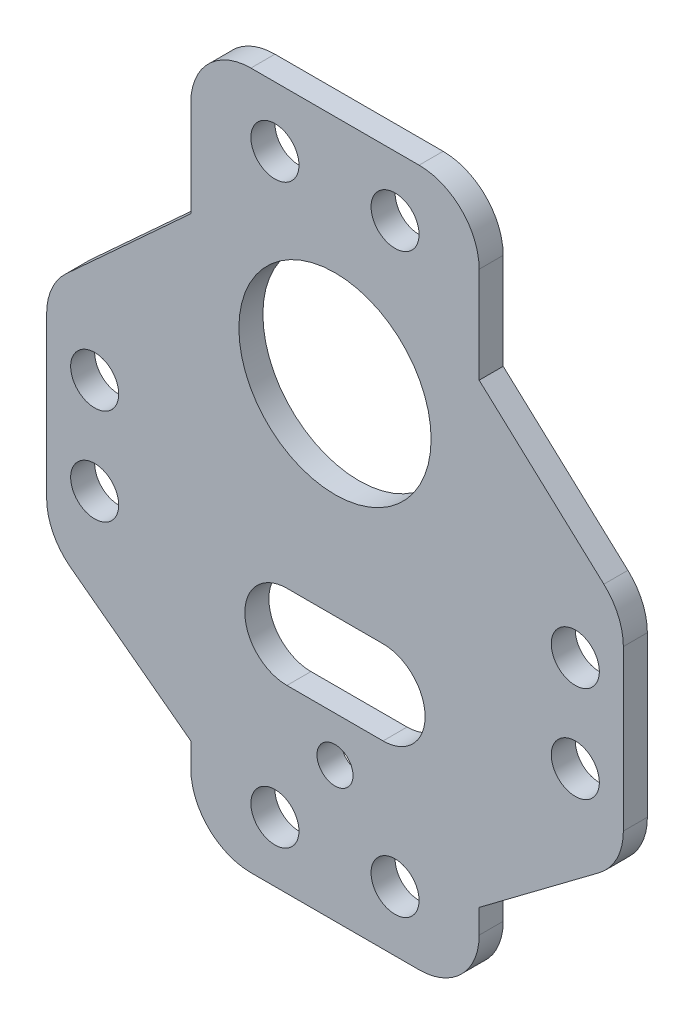
ISO-10303-21;
HEADER;
FILE_DESCRIPTION(('STEP AP214'),'2;1');
FILE_NAME('part.step','',(''),(''),'','','');
FILE_SCHEMA(('AUTOMOTIVE_DESIGN { 1 0 10303 214 1 1 1 1 }'));
ENDSEC;
DATA;
#1=APPLICATION_CONTEXT('core data for automotive mechanical design processes');
#2=APPLICATION_PROTOCOL_DEFINITION('international standard','automotive_design',2000,#1);
#3=PRODUCT_CONTEXT('',#1,'mechanical');
#4=PRODUCT('Part','Part','',(#3));
#5=PRODUCT_RELATED_PRODUCT_CATEGORY('part','',(#4));
#6=PRODUCT_DEFINITION_FORMATION('','',#4);
#7=PRODUCT_DEFINITION_CONTEXT('part definition',#1,'design');
#8=PRODUCT_DEFINITION('design','',#6,#7);
#9=PRODUCT_DEFINITION_SHAPE('','',#8);
#10=(LENGTH_UNIT() NAMED_UNIT(*) SI_UNIT(.MILLI.,.METRE.));
#11=(NAMED_UNIT(*) PLANE_ANGLE_UNIT() SI_UNIT($,.RADIAN.));
#12=(NAMED_UNIT(*) SI_UNIT($,.STERADIAN.) SOLID_ANGLE_UNIT());
#13=UNCERTAINTY_MEASURE_WITH_UNIT(LENGTH_MEASURE(1.E-05),#10,'distance_accuracy_value','');
#14=(GEOMETRIC_REPRESENTATION_CONTEXT(3) GLOBAL_UNCERTAINTY_ASSIGNED_CONTEXT((#13)) GLOBAL_UNIT_ASSIGNED_CONTEXT((#10,
#11,#12)) REPRESENTATION_CONTEXT('',''));
#15=CARTESIAN_POINT('',(0.,0.,0.));
#16=DIRECTION('',(0.,0.,1.));
#17=DIRECTION('',(1.,0.,0.));
#18=AXIS2_PLACEMENT_3D('',#15,#16,#17);
#19=CARTESIAN_POINT('',(0.,0.,2.));
#20=DIRECTION('',(0.,0.,-1.));
#21=DIRECTION('',(-1.,0.,0.));
#22=AXIS2_PLACEMENT_3D('',#19,#20,#21);
#23=PLANE('',#22);
#24=CARTESIAN_POINT('',(3.,-24.,2.));
#25=DIRECTION('',(0.,0.,1.));
#26=DIRECTION('',(1.,0.,0.));
#27=AXIS2_PLACEMENT_3D('',#24,#25,#26);
#28=CIRCLE('',#27,2.);
#29=CARTESIAN_POINT('',(5.,-24.,2.));
#30=VERTEX_POINT('',#29);
#31=EDGE_CURVE('E1252',#30,#30,#28,.T.);
#32=ORIENTED_EDGE('',*,*,#31,.F.);
#33=EDGE_LOOP('',(#32));
#34=FACE_BOUND('',#33,.T.);
#35=CARTESIAN_POINT('',(-12.,-48.,2.));
#36=DIRECTION('',(0.,0.,1.));
#37=DIRECTION('',(1.,0.,0.));
#38=AXIS2_PLACEMENT_3D('',#35,#36,#37);
#39=CIRCLE('',#38,2.);
#40=CARTESIAN_POINT('',(-9.99999999999999,-48.,2.));
#41=VERTEX_POINT('',#40);
#42=EDGE_CURVE('E1262',#41,#41,#39,.T.);
#43=ORIENTED_EDGE('',*,*,#42,.F.);
#44=EDGE_LOOP('',(#43));
#45=FACE_BOUND('',#44,.T.);
#46=CARTESIAN_POINT('',(3.,-72.,2.));
#47=DIRECTION('',(0.,0.,1.));
#48=DIRECTION('',(1.,0.,0.));
#49=AXIS2_PLACEMENT_3D('',#46,#47,#48);
#50=CIRCLE('',#49,2.);
#51=CARTESIAN_POINT('',(5.,-72.,2.));
#52=VERTEX_POINT('',#51);
#53=EDGE_CURVE('E1272',#52,#52,#50,.T.);
#54=ORIENTED_EDGE('',*,*,#53,.F.);
#55=EDGE_LOOP('',(#54));
#56=FACE_BOUND('',#55,.T.);
#57=CARTESIAN_POINT('',(28.,-56.,2.));
#58=DIRECTION('',(0.,0.,-1.));
#59=DIRECTION('',(-1.,0.,0.));
#60=AXIS2_PLACEMENT_3D('',#57,#58,#59);
#61=CIRCLE('',#60,2.);
#62=CARTESIAN_POINT('',(26.,-56.,2.));
#63=VERTEX_POINT('',#62);
#64=EDGE_CURVE('E1278',#63,#63,#61,.T.);
#65=ORIENTED_EDGE('',*,*,#64,.T.);
#66=EDGE_LOOP('',(#65));
#67=FACE_BOUND('',#66,.T.);
#68=CARTESIAN_POINT('',(28.,-48.,2.));
#69=DIRECTION('',(0.,0.,-1.));
#70=DIRECTION('',(-1.,0.,0.));
#71=AXIS2_PLACEMENT_3D('',#68,#69,#70);
#72=CIRCLE('',#71,2.);
#73=CARTESIAN_POINT('',(26.,-48.,2.));
#74=VERTEX_POINT('',#73);
#75=EDGE_CURVE('E1284',#74,#74,#72,.T.);
#76=ORIENTED_EDGE('',*,*,#75,.T.);
#77=EDGE_LOOP('',(#76));
#78=FACE_BOUND('',#77,.T.);
#79=DIRECTION('',(1.,0.,0.));
#80=VECTOR('',#79,1.);
#81=CARTESIAN_POINT('',(4.,-62.,2.));
#82=LINE('',#81,#80);
#83=CARTESIAN_POINT('',(4.,-62.,2.));
#84=VERTEX_POINT('',#83);
#85=CARTESIAN_POINT('',(12.,-62.,2.));
#86=VERTEX_POINT('',#85);
#87=EDGE_CURVE('E636',#84,#86,#82,.T.);
#88=ORIENTED_EDGE('',*,*,#87,.F.);
#89=CARTESIAN_POINT('',(4.,-58.5,2.));
#90=DIRECTION('',(0.,0.,1.));
#91=DIRECTION('',(1.,0.,0.));
#92=AXIS2_PLACEMENT_3D('',#89,#90,#91);
#93=CIRCLE('',#92,3.5);
#94=CARTESIAN_POINT('',(4.,-55.,2.));
#95=VERTEX_POINT('',#94);
#96=EDGE_CURVE('E660',#95,#84,#93,.T.);
#97=ORIENTED_EDGE('',*,*,#96,.F.);
#98=DIRECTION('',(1.,0.,0.));
#99=VECTOR('',#98,1.);
#100=CARTESIAN_POINT('',(4.,-55.,2.));
#101=LINE('',#100,#99);
#102=CARTESIAN_POINT('',(12.,-55.,2.));
#103=VERTEX_POINT('',#102);
#104=EDGE_CURVE('E658',#95,#103,#101,.T.);
#105=ORIENTED_EDGE('',*,*,#104,.T.);
#106=CARTESIAN_POINT('',(12.,-58.5,2.));
#107=DIRECTION('',(0.,0.,1.));
#108=DIRECTION('',(1.,0.,0.));
#109=AXIS2_PLACEMENT_3D('',#106,#107,#108);
#110=CIRCLE('',#109,3.5);
#111=EDGE_CURVE('E646',#86,#103,#110,.T.);
#112=ORIENTED_EDGE('',*,*,#111,.F.);
#113=EDGE_LOOP('',(#88,#97,#105,#112));
#114=FACE_BOUND('',#113,.T.);
#115=DIRECTION('',(-0.800000000000001,-0.599999999999999,0.));
#116=VECTOR('',#115,1.);
#117=CARTESIAN_POINT('',(32.,-61.,2.));
#118=LINE('',#117,#116);
#119=CARTESIAN_POINT('',(30.,-62.5,2.));
#120=VERTEX_POINT('',#119);
#121=CARTESIAN_POINT('',(20.,-70.,2.));
#122=VERTEX_POINT('',#121);
#123=EDGE_CURVE('E687',#120,#122,#118,.T.);
#124=ORIENTED_EDGE('',*,*,#123,.F.);
#125=CARTESIAN_POINT('',(27.,-58.5,2.));
#126=DIRECTION('',(0.,0.,-1.));
#127=DIRECTION('',(-1.,0.,0.));
#128=AXIS2_PLACEMENT_3D('',#125,#126,#127);
#129=CIRCLE('',#128,5.);
#130=CARTESIAN_POINT('',(32.,-58.5,2.));
#131=VERTEX_POINT('',#130);
#132=EDGE_CURVE('E791',#120,#131,#129,.F.);
#133=ORIENTED_EDGE('',*,*,#132,.T.);
#134=DIRECTION('',(0.,-1.,0.));
#135=VECTOR('',#134,1.);
#136=CARTESIAN_POINT('',(32.,-43.,2.));
#137=LINE('',#136,#135);
#138=CARTESIAN_POINT('',(32.,-45.1995085817082,2.));
#139=VERTEX_POINT('',#138);
#140=EDGE_CURVE('E684',#139,#131,#137,.T.);
#141=ORIENTED_EDGE('',*,*,#140,.F.);
#142=CARTESIAN_POINT('',(27.,-45.1995085817082,2.));
#143=DIRECTION('',(0.,0.,-1.));
#144=DIRECTION('',(-1.,0.,0.));
#145=AXIS2_PLACEMENT_3D('',#142,#143,#144);
#146=CIRCLE('',#145,5.);
#147=CARTESIAN_POINT('',(30.3786231425867,-41.5137378807045,2.));
#148=VERTEX_POINT('',#147);
#149=EDGE_CURVE('E789',#139,#148,#146,.F.);
#150=ORIENTED_EDGE('',*,*,#149,.T.);
#151=DIRECTION('',(-0.737154140200742,0.675724628517346,0.));
#152=VECTOR('',#151,1.);
#153=CARTESIAN_POINT('',(32.,-43.,2.));
#154=LINE('',#153,#152);
#155=CARTESIAN_POINT('',(20.,-32.,2.));
#156=VERTEX_POINT('',#155);
#157=EDGE_CURVE('E712',#148,#156,#154,.T.);
#158=ORIENTED_EDGE('',*,*,#157,.T.);
#159=DIRECTION('',(0.,1.,0.));
#160=VECTOR('',#159,1.);
#161=CARTESIAN_POINT('',(20.,-32.,2.));
#162=LINE('',#161,#160);
#163=CARTESIAN_POINT('',(20.,-24.,2.));
#164=VERTEX_POINT('',#163);
#165=EDGE_CURVE('E709',#156,#164,#162,.T.);
#166=ORIENTED_EDGE('',*,*,#165,.T.);
#167=CARTESIAN_POINT('',(15.,-24.,2.));
#168=DIRECTION('',(0.,0.,-1.));
#169=DIRECTION('',(-1.,0.,0.));
#170=AXIS2_PLACEMENT_3D('',#167,#168,#169);
#171=CIRCLE('',#170,5.);
#172=CARTESIAN_POINT('',(15.,-19.,2.));
#173=VERTEX_POINT('',#172);
#174=EDGE_CURVE('E781',#164,#173,#171,.F.);
#175=ORIENTED_EDGE('',*,*,#174,.T.);
#176=DIRECTION('',(-1.,0.,0.));
#177=VECTOR('',#176,1.);
#178=CARTESIAN_POINT('',(20.,-19.,2.));
#179=LINE('',#178,#177);
#180=CARTESIAN_POINT('',(0.999999999999997,-19.,2.));
#181=VERTEX_POINT('',#180);
#182=EDGE_CURVE('E706',#173,#181,#179,.T.);
#183=ORIENTED_EDGE('',*,*,#182,.T.);
#184=CARTESIAN_POINT('',(0.999999999999999,-24.,2.));
#185=DIRECTION('',(0.,0.,-1.));
#186=DIRECTION('',(-1.,0.,0.));
#187=AXIS2_PLACEMENT_3D('',#184,#185,#186);
#188=CIRCLE('',#187,5.);
#189=CARTESIAN_POINT('',(-4.,-24.,2.));
#190=VERTEX_POINT('',#189);
#191=EDGE_CURVE('E783',#181,#190,#188,.F.);
#192=ORIENTED_EDGE('',*,*,#191,.T.);
#193=DIRECTION('',(0.,1.,0.));
#194=VECTOR('',#193,1.);
#195=CARTESIAN_POINT('',(-4.00000000000001,-32.,2.));
#196=LINE('',#195,#194);
#197=CARTESIAN_POINT('',(-4.00000000000001,-32.,2.));
#198=VERTEX_POINT('',#197);
#199=EDGE_CURVE('E703',#198,#190,#196,.T.);
#200=ORIENTED_EDGE('',*,*,#199,.F.);
#201=DIRECTION('',(0.737154140200741,0.675724628517347,0.));
#202=VECTOR('',#201,1.);
#203=CARTESIAN_POINT('',(-16.,-43.,2.));
#204=LINE('',#203,#202);
#205=CARTESIAN_POINT('',(-14.3786231425867,-41.5137378807045,2.));
#206=VERTEX_POINT('',#205);
#207=EDGE_CURVE('E701',#206,#198,#204,.T.);
#208=ORIENTED_EDGE('',*,*,#207,.F.);
#209=CARTESIAN_POINT('',(-11.,-45.1995085817082,2.));
#210=DIRECTION('',(0.,0.,-1.));
#211=DIRECTION('',(-1.,0.,0.));
#212=AXIS2_PLACEMENT_3D('',#209,#210,#211);
#213=CIRCLE('',#212,5.);
#214=CARTESIAN_POINT('',(-16.,-45.1995085817082,2.));
#215=VERTEX_POINT('',#214);
#216=EDGE_CURVE('E785',#206,#215,#213,.F.);
#217=ORIENTED_EDGE('',*,*,#216,.T.);
#218=DIRECTION('',(0.,-1.,0.));
#219=VECTOR('',#218,1.);
#220=CARTESIAN_POINT('',(-16.,-43.,2.));
#221=LINE('',#220,#219);
#222=CARTESIAN_POINT('',(-16.,-58.5,2.));
#223=VERTEX_POINT('',#222);
#224=EDGE_CURVE('E698',#215,#223,#221,.T.);
#225=ORIENTED_EDGE('',*,*,#224,.T.);
#226=CARTESIAN_POINT('',(-11.,-58.5,2.));
#227=DIRECTION('',(0.,0.,-1.));
#228=DIRECTION('',(-1.,0.,0.));
#229=AXIS2_PLACEMENT_3D('',#226,#227,#228);
#230=CIRCLE('',#229,5.);
#231=CARTESIAN_POINT('',(-14.,-62.5,2.));
#232=VERTEX_POINT('',#231);
#233=EDGE_CURVE('E787',#223,#232,#230,.F.);
#234=ORIENTED_EDGE('',*,*,#233,.T.);
#235=DIRECTION('',(0.8,-0.6,0.));
#236=VECTOR('',#235,1.);
#237=CARTESIAN_POINT('',(-16.,-61.,2.));
#238=LINE('',#237,#236);
#239=CARTESIAN_POINT('',(-4.,-70.,2.));
#240=VERTEX_POINT('',#239);
#241=EDGE_CURVE('E696',#232,#240,#238,.T.);
#242=ORIENTED_EDGE('',*,*,#241,.T.);
#243=DIRECTION('',(0.,-1.,0.));
#244=VECTOR('',#243,1.);
#245=CARTESIAN_POINT('',(-4.,-70.,2.));
#246=LINE('',#245,#244);
#247=CARTESIAN_POINT('',(-4.,-72.,2.));
#248=VERTEX_POINT('',#247);
#249=EDGE_CURVE('E694',#240,#248,#246,.T.);
#250=ORIENTED_EDGE('',*,*,#249,.T.);
#251=CARTESIAN_POINT('',(1.,-72.,2.));
#252=DIRECTION('',(0.,0.,-1.));
#253=DIRECTION('',(-1.,0.,0.));
#254=AXIS2_PLACEMENT_3D('',#251,#252,#253);
#255=CIRCLE('',#254,5.);
#256=CARTESIAN_POINT('',(1.,-77.,2.));
#257=VERTEX_POINT('',#256);
#258=EDGE_CURVE('E494',#248,#257,#255,.F.);
#259=ORIENTED_EDGE('',*,*,#258,.T.);
#260=DIRECTION('',(-1.,0.,0.));
#261=VECTOR('',#260,1.);
#262=CARTESIAN_POINT('',(20.,-77.,2.));
#263=LINE('',#262,#261);
#264=CARTESIAN_POINT('',(15.,-77.,2.));
#265=VERTEX_POINT('',#264);
#266=EDGE_CURVE('E692',#265,#257,#263,.T.);
#267=ORIENTED_EDGE('',*,*,#266,.F.);
#268=CARTESIAN_POINT('',(15.,-72.,2.));
#269=DIRECTION('',(0.,0.,-1.));
#270=DIRECTION('',(-1.,0.,0.));
#271=AXIS2_PLACEMENT_3D('',#268,#269,#270);
#272=CIRCLE('',#271,5.);
#273=CARTESIAN_POINT('',(20.,-72.,2.));
#274=VERTEX_POINT('',#273);
#275=EDGE_CURVE('E488',#265,#274,#272,.F.);
#276=ORIENTED_EDGE('',*,*,#275,.T.);
#277=DIRECTION('',(0.,-1.,0.));
#278=VECTOR('',#277,1.);
#279=CARTESIAN_POINT('',(20.,-70.,2.));
#280=LINE('',#279,#278);
#281=EDGE_CURVE('E690',#122,#274,#280,.T.);
#282=ORIENTED_EDGE('',*,*,#281,.F.);
#283=EDGE_LOOP('',(#124,#133,#141,#150,#158,#166,#175,#183,#192,#200,#208,#217,#225,#234,#242,
#250,#259,#267,#276,#282));
#284=FACE_BOUND('',#283,.T.);
#285=CARTESIAN_POINT('',(8.00000000000001,-38.25,2.));
#286=DIRECTION('',(0.,0.,1.));
#287=DIRECTION('',(1.,0.,0.));
#288=AXIS2_PLACEMENT_3D('',#285,#286,#287);
#289=CIRCLE('',#288,8.);
#290=CARTESIAN_POINT('',(16.,-38.25,2.));
#291=VERTEX_POINT('',#290);
#292=EDGE_CURVE('E678',#291,#291,#289,.T.);
#293=ORIENTED_EDGE('',*,*,#292,.F.);
#294=EDGE_LOOP('',(#293));
#295=FACE_BOUND('',#294,.T.);
#296=CARTESIAN_POINT('',(13.,-72.,2.));
#297=DIRECTION('',(0.,0.,1.));
#298=DIRECTION('',(1.,0.,0.));
#299=AXIS2_PLACEMENT_3D('',#296,#297,#298);
#300=CIRCLE('',#299,2.);
#301=CARTESIAN_POINT('',(15.,-72.,2.));
#302=VERTEX_POINT('',#301);
#303=EDGE_CURVE('E667',#302,#302,#300,.T.);
#304=ORIENTED_EDGE('',*,*,#303,.F.);
#305=EDGE_LOOP('',(#304));
#306=FACE_BOUND('',#305,.T.);
#307=CARTESIAN_POINT('',(-12.,-56.,2.));
#308=DIRECTION('',(0.,0.,1.));
#309=DIRECTION('',(1.,0.,0.));
#310=AXIS2_PLACEMENT_3D('',#307,#308,#309);
#311=CIRCLE('',#310,2.);
#312=CARTESIAN_POINT('',(-9.99999999999999,-56.,2.));
#313=VERTEX_POINT('',#312);
#314=EDGE_CURVE('E1267',#313,#313,#311,.T.);
#315=ORIENTED_EDGE('',*,*,#314,.F.);
#316=EDGE_LOOP('',(#315));
#317=FACE_BOUND('',#316,.T.);
#318=CARTESIAN_POINT('',(13.,-24.,2.));
#319=DIRECTION('',(0.,0.,1.));
#320=DIRECTION('',(1.,0.,0.));
#321=AXIS2_PLACEMENT_3D('',#318,#319,#320);
#322=CIRCLE('',#321,2.);
#323=CARTESIAN_POINT('',(15.,-24.,2.));
#324=VERTEX_POINT('',#323);
#325=EDGE_CURVE('E1257',#324,#324,#322,.T.);
#326=ORIENTED_EDGE('',*,*,#325,.F.);
#327=EDGE_LOOP('',(#326));
#328=FACE_BOUND('',#327,.T.);
#329=CARTESIAN_POINT('',(8.00000000000001,-65.75,2.));
#330=DIRECTION('',(0.,0.,1.));
#331=DIRECTION('',(1.,0.,0.));
#332=AXIS2_PLACEMENT_3D('',#329,#330,#331);
#333=CIRCLE('',#332,1.5);
#334=CARTESIAN_POINT('',(9.50000000000002,-65.75,2.));
#335=VERTEX_POINT('',#334);
#336=EDGE_CURVE('E1246',#335,#335,#333,.T.);
#337=ORIENTED_EDGE('',*,*,#336,.F.);
#338=EDGE_LOOP('',(#337));
#339=FACE_BOUND('',#338,.T.);
#340=ADVANCED_FACE('F473',(#34,#45,#56,#67,#78,#114,#284,#295,#306,#317,#328,#339),#23,.F.);
#341=CARTESIAN_POINT('',(0.,0.,0.));
#342=DIRECTION('',(0.,0.,-1.));
#343=DIRECTION('',(-1.,0.,0.));
#344=AXIS2_PLACEMENT_3D('',#341,#342,#343);
#345=PLANE('',#344);
#346=CARTESIAN_POINT('',(3.,-24.,0.));
#347=DIRECTION('',(0.,0.,1.));
#348=DIRECTION('',(1.,0.,0.));
#349=AXIS2_PLACEMENT_3D('',#346,#347,#348);
#350=CIRCLE('',#349,2.);
#351=CARTESIAN_POINT('',(5.,-24.,0.));
#352=VERTEX_POINT('',#351);
#353=EDGE_CURVE('E1249',#352,#352,#350,.T.);
#354=ORIENTED_EDGE('',*,*,#353,.T.);
#355=EDGE_LOOP('',(#354));
#356=FACE_BOUND('',#355,.T.);
#357=CARTESIAN_POINT('',(-12.,-48.,0.));
#358=DIRECTION('',(0.,0.,1.));
#359=DIRECTION('',(1.,0.,0.));
#360=AXIS2_PLACEMENT_3D('',#357,#358,#359);
#361=CIRCLE('',#360,2.);
#362=CARTESIAN_POINT('',(-9.99999999999999,-48.,0.));
#363=VERTEX_POINT('',#362);
#364=EDGE_CURVE('E1260',#363,#363,#361,.T.);
#365=ORIENTED_EDGE('',*,*,#364,.T.);
#366=EDGE_LOOP('',(#365));
#367=FACE_BOUND('',#366,.T.);
#368=CARTESIAN_POINT('',(3.,-72.,0.));
#369=DIRECTION('',(0.,0.,1.));
#370=DIRECTION('',(1.,0.,0.));
#371=AXIS2_PLACEMENT_3D('',#368,#369,#370);
#372=CIRCLE('',#371,2.);
#373=CARTESIAN_POINT('',(5.,-72.,0.));
#374=VERTEX_POINT('',#373);
#375=EDGE_CURVE('E1270',#374,#374,#372,.T.);
#376=ORIENTED_EDGE('',*,*,#375,.T.);
#377=EDGE_LOOP('',(#376));
#378=FACE_BOUND('',#377,.T.);
#379=CARTESIAN_POINT('',(28.,-56.,0.));
#380=DIRECTION('',(0.,0.,-1.));
#381=DIRECTION('',(-1.,0.,0.));
#382=AXIS2_PLACEMENT_3D('',#379,#380,#381);
#383=CIRCLE('',#382,2.);
#384=CARTESIAN_POINT('',(26.,-56.,0.));
#385=VERTEX_POINT('',#384);
#386=EDGE_CURVE('E1275',#385,#385,#383,.T.);
#387=ORIENTED_EDGE('',*,*,#386,.F.);
#388=EDGE_LOOP('',(#387));
#389=FACE_BOUND('',#388,.T.);
#390=CARTESIAN_POINT('',(28.,-48.,0.));
#391=DIRECTION('',(0.,0.,-1.));
#392=DIRECTION('',(-1.,0.,0.));
#393=AXIS2_PLACEMENT_3D('',#390,#391,#392);
#394=CIRCLE('',#393,2.);
#395=CARTESIAN_POINT('',(26.,-48.,0.));
#396=VERTEX_POINT('',#395);
#397=EDGE_CURVE('E1281',#396,#396,#394,.T.);
#398=ORIENTED_EDGE('',*,*,#397,.F.);
#399=EDGE_LOOP('',(#398));
#400=FACE_BOUND('',#399,.T.);
#401=CARTESIAN_POINT('',(4.,-58.5,0.));
#402=DIRECTION('',(0.,0.,1.));
#403=DIRECTION('',(1.,0.,0.));
#404=AXIS2_PLACEMENT_3D('',#401,#402,#403);
#405=CIRCLE('',#404,3.5);
#406=CARTESIAN_POINT('',(4.,-55.,0.));
#407=VERTEX_POINT('',#406);
#408=CARTESIAN_POINT('',(4.,-62.,0.));
#409=VERTEX_POINT('',#408);
#410=EDGE_CURVE('E647',#407,#409,#405,.T.);
#411=ORIENTED_EDGE('',*,*,#410,.T.);
#412=DIRECTION('',(1.,0.,0.));
#413=VECTOR('',#412,1.);
#414=CARTESIAN_POINT('',(4.,-62.,0.));
#415=LINE('',#414,#413);
#416=CARTESIAN_POINT('',(12.,-62.,0.));
#417=VERTEX_POINT('',#416);
#418=EDGE_CURVE('E665',#409,#417,#415,.T.);
#419=ORIENTED_EDGE('',*,*,#418,.T.);
#420=CARTESIAN_POINT('',(12.,-58.5,0.));
#421=DIRECTION('',(0.,0.,1.));
#422=DIRECTION('',(1.,0.,0.));
#423=AXIS2_PLACEMENT_3D('',#420,#421,#422);
#424=CIRCLE('',#423,3.5);
#425=CARTESIAN_POINT('',(12.,-55.,0.));
#426=VERTEX_POINT('',#425);
#427=EDGE_CURVE('E653',#417,#426,#424,.T.);
#428=ORIENTED_EDGE('',*,*,#427,.T.);
#429=DIRECTION('',(1.,0.,0.));
#430=VECTOR('',#429,1.);
#431=CARTESIAN_POINT('',(4.,-55.,0.));
#432=LINE('',#431,#430);
#433=EDGE_CURVE('E669',#407,#426,#432,.T.);
#434=ORIENTED_EDGE('',*,*,#433,.F.);
#435=EDGE_LOOP('',(#411,#419,#428,#434));
#436=FACE_BOUND('',#435,.T.);
#437=DIRECTION('',(0.,-1.,0.));
#438=VECTOR('',#437,1.);
#439=CARTESIAN_POINT('',(32.,-43.,0.));
#440=LINE('',#439,#438);
#441=CARTESIAN_POINT('',(32.,-45.1995085817082,0.));
#442=VERTEX_POINT('',#441);
#443=CARTESIAN_POINT('',(32.,-58.5,0.));
#444=VERTEX_POINT('',#443);
#445=EDGE_CURVE('E681',#442,#444,#440,.T.);
#446=ORIENTED_EDGE('',*,*,#445,.T.);
#447=CARTESIAN_POINT('',(27.,-58.5,0.));
#448=DIRECTION('',(0.,0.,-1.));
#449=DIRECTION('',(-1.,0.,0.));
#450=AXIS2_PLACEMENT_3D('',#447,#448,#449);
#451=CIRCLE('',#450,5.);
#452=CARTESIAN_POINT('',(30.,-62.5,0.));
#453=VERTEX_POINT('',#452);
#454=EDGE_CURVE('E775',#444,#453,#451,.T.);
#455=ORIENTED_EDGE('',*,*,#454,.T.);
#456=DIRECTION('',(-0.800000000000001,-0.599999999999999,0.));
#457=VECTOR('',#456,1.);
#458=CARTESIAN_POINT('',(32.,-61.,0.));
#459=LINE('',#458,#457);
#460=CARTESIAN_POINT('',(20.,-70.,0.));
#461=VERTEX_POINT('',#460);
#462=EDGE_CURVE('E717',#453,#461,#459,.T.);
#463=ORIENTED_EDGE('',*,*,#462,.T.);
#464=DIRECTION('',(0.,-1.,0.));
#465=VECTOR('',#464,1.);
#466=CARTESIAN_POINT('',(20.,-70.,0.));
#467=LINE('',#466,#465);
#468=CARTESIAN_POINT('',(20.,-72.,0.));
#469=VERTEX_POINT('',#468);
#470=EDGE_CURVE('E719',#461,#469,#467,.T.);
#471=ORIENTED_EDGE('',*,*,#470,.T.);
#472=CARTESIAN_POINT('',(15.,-72.,0.));
#473=DIRECTION('',(0.,0.,-1.));
#474=DIRECTION('',(-1.,0.,0.));
#475=AXIS2_PLACEMENT_3D('',#472,#473,#474);
#476=CIRCLE('',#475,5.);
#477=CARTESIAN_POINT('',(15.,-77.,0.));
#478=VERTEX_POINT('',#477);
#479=EDGE_CURVE('E763',#469,#478,#476,.T.);
#480=ORIENTED_EDGE('',*,*,#479,.T.);
#481=DIRECTION('',(-1.,0.,0.));
#482=VECTOR('',#481,1.);
#483=CARTESIAN_POINT('',(20.,-77.,0.));
#484=LINE('',#483,#482);
#485=CARTESIAN_POINT('',(1.,-77.,0.));
#486=VERTEX_POINT('',#485);
#487=EDGE_CURVE('E722',#478,#486,#484,.T.);
#488=ORIENTED_EDGE('',*,*,#487,.T.);
#489=CARTESIAN_POINT('',(1.,-72.,0.));
#490=DIRECTION('',(0.,0.,-1.));
#491=DIRECTION('',(-1.,0.,0.));
#492=AXIS2_PLACEMENT_3D('',#489,#490,#491);
#493=CIRCLE('',#492,5.);
#494=CARTESIAN_POINT('',(-4.,-72.,0.));
#495=VERTEX_POINT('',#494);
#496=EDGE_CURVE('E761',#486,#495,#493,.T.);
#497=ORIENTED_EDGE('',*,*,#496,.T.);
#498=DIRECTION('',(0.,-1.,0.));
#499=VECTOR('',#498,1.);
#500=CARTESIAN_POINT('',(-4.,-70.,0.));
#501=LINE('',#500,#499);
#502=CARTESIAN_POINT('',(-4.,-70.,0.));
#503=VERTEX_POINT('',#502);
#504=EDGE_CURVE('E725',#503,#495,#501,.T.);
#505=ORIENTED_EDGE('',*,*,#504,.F.);
#506=DIRECTION('',(0.8,-0.6,0.));
#507=VECTOR('',#506,1.);
#508=CARTESIAN_POINT('',(-16.,-61.,0.));
#509=LINE('',#508,#507);
#510=CARTESIAN_POINT('',(-14.,-62.5,0.));
#511=VERTEX_POINT('',#510);
#512=EDGE_CURVE('E728',#511,#503,#509,.T.);
#513=ORIENTED_EDGE('',*,*,#512,.F.);
#514=CARTESIAN_POINT('',(-11.,-58.5,0.));
#515=DIRECTION('',(0.,0.,-1.));
#516=DIRECTION('',(-1.,0.,0.));
#517=AXIS2_PLACEMENT_3D('',#514,#515,#516);
#518=CIRCLE('',#517,5.);
#519=CARTESIAN_POINT('',(-16.,-58.5,0.));
#520=VERTEX_POINT('',#519);
#521=EDGE_CURVE('E771',#511,#520,#518,.T.);
#522=ORIENTED_EDGE('',*,*,#521,.T.);
#523=DIRECTION('',(0.,-1.,0.));
#524=VECTOR('',#523,1.);
#525=CARTESIAN_POINT('',(-16.,-43.,0.));
#526=LINE('',#525,#524);
#527=CARTESIAN_POINT('',(-16.,-45.1995085817082,0.));
#528=VERTEX_POINT('',#527);
#529=EDGE_CURVE('E730',#528,#520,#526,.T.);
#530=ORIENTED_EDGE('',*,*,#529,.F.);
#531=CARTESIAN_POINT('',(-11.,-45.1995085817082,0.));
#532=DIRECTION('',(0.,0.,-1.));
#533=DIRECTION('',(-1.,0.,0.));
#534=AXIS2_PLACEMENT_3D('',#531,#532,#533);
#535=CIRCLE('',#534,5.);
#536=CARTESIAN_POINT('',(-14.3786231425867,-41.5137378807045,0.));
#537=VERTEX_POINT('',#536);
#538=EDGE_CURVE('E769',#528,#537,#535,.T.);
#539=ORIENTED_EDGE('',*,*,#538,.T.);
#540=DIRECTION('',(0.737154140200741,0.675724628517347,0.));
#541=VECTOR('',#540,1.);
#542=CARTESIAN_POINT('',(-16.,-43.,0.));
#543=LINE('',#542,#541);
#544=CARTESIAN_POINT('',(-4.00000000000001,-32.,0.));
#545=VERTEX_POINT('',#544);
#546=EDGE_CURVE('E733',#537,#545,#543,.T.);
#547=ORIENTED_EDGE('',*,*,#546,.T.);
#548=DIRECTION('',(0.,1.,0.));
#549=VECTOR('',#548,1.);
#550=CARTESIAN_POINT('',(-4.00000000000001,-32.,0.));
#551=LINE('',#550,#549);
#552=CARTESIAN_POINT('',(-4.,-24.,0.));
#553=VERTEX_POINT('',#552);
#554=EDGE_CURVE('E735',#545,#553,#551,.T.);
#555=ORIENTED_EDGE('',*,*,#554,.T.);
#556=CARTESIAN_POINT('',(0.999999999999999,-24.,0.));
#557=DIRECTION('',(0.,0.,-1.));
#558=DIRECTION('',(-1.,0.,0.));
#559=AXIS2_PLACEMENT_3D('',#556,#557,#558);
#560=CIRCLE('',#559,5.);
#561=CARTESIAN_POINT('',(0.999999999999997,-19.,0.));
#562=VERTEX_POINT('',#561);
#563=EDGE_CURVE('E767',#553,#562,#560,.T.);
#564=ORIENTED_EDGE('',*,*,#563,.T.);
#565=DIRECTION('',(-1.,0.,0.));
#566=VECTOR('',#565,1.);
#567=CARTESIAN_POINT('',(20.,-19.,0.));
#568=LINE('',#567,#566);
#569=CARTESIAN_POINT('',(15.,-19.,0.));
#570=VERTEX_POINT('',#569);
#571=EDGE_CURVE('E738',#570,#562,#568,.T.);
#572=ORIENTED_EDGE('',*,*,#571,.F.);
#573=CARTESIAN_POINT('',(15.,-24.,0.));
#574=DIRECTION('',(0.,0.,-1.));
#575=DIRECTION('',(-1.,0.,0.));
#576=AXIS2_PLACEMENT_3D('',#573,#574,#575);
#577=CIRCLE('',#576,5.);
#578=CARTESIAN_POINT('',(20.,-24.,0.));
#579=VERTEX_POINT('',#578);
#580=EDGE_CURVE('E765',#570,#579,#577,.T.);
#581=ORIENTED_EDGE('',*,*,#580,.T.);
#582=DIRECTION('',(0.,1.,0.));
#583=VECTOR('',#582,1.);
#584=CARTESIAN_POINT('',(20.,-32.,0.));
#585=LINE('',#584,#583);
#586=CARTESIAN_POINT('',(20.,-32.,0.));
#587=VERTEX_POINT('',#586);
#588=EDGE_CURVE('E741',#587,#579,#585,.T.);
#589=ORIENTED_EDGE('',*,*,#588,.F.);
#590=DIRECTION('',(-0.737154140200742,0.675724628517346,0.));
#591=VECTOR('',#590,1.);
#592=CARTESIAN_POINT('',(32.,-43.,0.));
#593=LINE('',#592,#591);
#594=CARTESIAN_POINT('',(30.3786231425867,-41.5137378807045,0.));
#595=VERTEX_POINT('',#594);
#596=EDGE_CURVE('E688',#595,#587,#593,.T.);
#597=ORIENTED_EDGE('',*,*,#596,.F.);
#598=CARTESIAN_POINT('',(27.,-45.1995085817082,0.));
#599=DIRECTION('',(0.,0.,-1.));
#600=DIRECTION('',(-1.,0.,0.));
#601=AXIS2_PLACEMENT_3D('',#598,#599,#600);
#602=CIRCLE('',#601,5.);
#603=EDGE_CURVE('E773',#595,#442,#602,.T.);
#604=ORIENTED_EDGE('',*,*,#603,.T.);
#605=EDGE_LOOP('',(#446,#455,#463,#471,#480,#488,#497,#505,#513,#522,#530,#539,#547,#555,#564,
#572,#581,#589,#597,#604));
#606=FACE_BOUND('',#605,.T.);
#607=CARTESIAN_POINT('',(8.00000000000001,-38.25,0.));
#608=DIRECTION('',(0.,0.,1.));
#609=DIRECTION('',(1.,0.,0.));
#610=AXIS2_PLACEMENT_3D('',#607,#608,#609);
#611=CIRCLE('',#610,8.);
#612=CARTESIAN_POINT('',(16.,-38.25,0.));
#613=VERTEX_POINT('',#612);
#614=EDGE_CURVE('E654',#613,#613,#611,.T.);
#615=ORIENTED_EDGE('',*,*,#614,.T.);
#616=EDGE_LOOP('',(#615));
#617=FACE_BOUND('',#616,.T.);
#618=CARTESIAN_POINT('',(13.,-72.,0.));
#619=DIRECTION('',(0.,0.,1.));
#620=DIRECTION('',(1.,0.,0.));
#621=AXIS2_PLACEMENT_3D('',#618,#619,#620);
#622=CIRCLE('',#621,2.);
#623=CARTESIAN_POINT('',(15.,-72.,0.));
#624=VERTEX_POINT('',#623);
#625=EDGE_CURVE('E1233',#624,#624,#622,.T.);
#626=ORIENTED_EDGE('',*,*,#625,.T.);
#627=EDGE_LOOP('',(#626));
#628=FACE_BOUND('',#627,.T.);
#629=CARTESIAN_POINT('',(-12.,-56.,0.));
#630=DIRECTION('',(0.,0.,1.));
#631=DIRECTION('',(1.,0.,0.));
#632=AXIS2_PLACEMENT_3D('',#629,#630,#631);
#633=CIRCLE('',#632,2.);
#634=CARTESIAN_POINT('',(-9.99999999999999,-56.,0.));
#635=VERTEX_POINT('',#634);
#636=EDGE_CURVE('E1237',#635,#635,#633,.T.);
#637=ORIENTED_EDGE('',*,*,#636,.T.);
#638=EDGE_LOOP('',(#637));
#639=FACE_BOUND('',#638,.T.);
#640=CARTESIAN_POINT('',(13.,-24.,0.));
#641=DIRECTION('',(0.,0.,1.));
#642=DIRECTION('',(1.,0.,0.));
#643=AXIS2_PLACEMENT_3D('',#640,#641,#642);
#644=CIRCLE('',#643,2.);
#645=CARTESIAN_POINT('',(15.,-24.,0.));
#646=VERTEX_POINT('',#645);
#647=EDGE_CURVE('E1241',#646,#646,#644,.T.);
#648=ORIENTED_EDGE('',*,*,#647,.T.);
#649=EDGE_LOOP('',(#648));
#650=FACE_BOUND('',#649,.T.);
#651=CARTESIAN_POINT('',(8.00000000000001,-65.75,0.));
#652=DIRECTION('',(0.,0.,1.));
#653=DIRECTION('',(1.,0.,0.));
#654=AXIS2_PLACEMENT_3D('',#651,#652,#653);
#655=CIRCLE('',#654,1.5);
#656=CARTESIAN_POINT('',(9.50000000000002,-65.75,0.));
#657=VERTEX_POINT('',#656);
#658=EDGE_CURVE('E1244',#657,#657,#655,.T.);
#659=ORIENTED_EDGE('',*,*,#658,.T.);
#660=EDGE_LOOP('',(#659));
#661=FACE_BOUND('',#660,.T.);
#662=ADVANCED_FACE('F836',(#356,#367,#378,#389,#400,#436,#606,#617,#628,#639,#650,#661),#345,.T.);
#663=CARTESIAN_POINT('',(32.,-43.,2.));
#664=DIRECTION('',(1.,0.,0.));
#665=DIRECTION('',(0.,0.,-1.));
#666=AXIS2_PLACEMENT_3D('',#663,#664,#665);
#667=PLANE('',#666);
#668=ORIENTED_EDGE('',*,*,#140,.T.);
#669=DIRECTION('',(0.,0.,-1.));
#670=VECTOR('',#669,1.);
#671=CARTESIAN_POINT('',(32.,-58.5,2.));
#672=LINE('',#671,#670);
#673=EDGE_CURVE('E758',#131,#444,#672,.T.);
#674=ORIENTED_EDGE('',*,*,#673,.T.);
#675=ORIENTED_EDGE('',*,*,#445,.F.);
#676=DIRECTION('',(0.,0.,-1.));
#677=VECTOR('',#676,1.);
#678=CARTESIAN_POINT('',(32.,-45.1995085817082,2.));
#679=LINE('',#678,#677);
#680=EDGE_CURVE('E748',#442,#139,#679,.F.);
#681=ORIENTED_EDGE('',*,*,#680,.T.);
#682=EDGE_LOOP('',(#668,#674,#675,#681));
#683=FACE_BOUND('',#682,.T.);
#684=ADVANCED_FACE('F849',(#683),#667,.T.);
#685=CARTESIAN_POINT('',(32.,-43.,2.));
#686=DIRECTION('',(-0.675724628517346,-0.737154140200742,0.));
#687=DIRECTION('',(0.737154140200742,-0.675724628517346,0.));
#688=AXIS2_PLACEMENT_3D('',#685,#686,#687);
#689=PLANE('',#688);
#690=ORIENTED_EDGE('',*,*,#157,.F.);
#691=DIRECTION('',(0.,0.,-1.));
#692=VECTOR('',#691,1.);
#693=CARTESIAN_POINT('',(30.3786231425867,-41.5137378807045,0.));
#694=LINE('',#693,#692);
#695=EDGE_CURVE('E793',#148,#595,#694,.T.);
#696=ORIENTED_EDGE('',*,*,#695,.T.);
#697=ORIENTED_EDGE('',*,*,#596,.T.);
#698=DIRECTION('',(0.,0.,-1.));
#699=VECTOR('',#698,1.);
#700=CARTESIAN_POINT('',(20.,-32.,2.));
#701=LINE('',#700,#699);
#702=EDGE_CURVE('E745',#156,#587,#701,.T.);
#703=ORIENTED_EDGE('',*,*,#702,.F.);
#704=EDGE_LOOP('',(#690,#696,#697,#703));
#705=FACE_BOUND('',#704,.T.);
#706=ADVANCED_FACE('F859',(#705),#689,.F.);
#707=CARTESIAN_POINT('',(20.,-32.,2.));
#708=DIRECTION('',(-1.,0.,0.));
#709=DIRECTION('',(0.,-1.,0.));
#710=AXIS2_PLACEMENT_3D('',#707,#708,#709);
#711=PLANE('',#710);
#712=ORIENTED_EDGE('',*,*,#588,.T.);
#713=DIRECTION('',(0.,0.,-1.));
#714=VECTOR('',#713,1.);
#715=CARTESIAN_POINT('',(20.,-24.,2.));
#716=LINE('',#715,#714);
#717=EDGE_CURVE('E814',#579,#164,#716,.F.);
#718=ORIENTED_EDGE('',*,*,#717,.T.);
#719=ORIENTED_EDGE('',*,*,#165,.F.);
#720=ORIENTED_EDGE('',*,*,#702,.T.);
#721=EDGE_LOOP('',(#712,#718,#719,#720));
#722=FACE_BOUND('',#721,.T.);
#723=ADVANCED_FACE('F934',(#722),#711,.F.);
#724=CARTESIAN_POINT('',(20.,-19.,2.));
#725=DIRECTION('',(0.,-1.,0.));
#726=DIRECTION('',(0.,0.,-1.));
#727=AXIS2_PLACEMENT_3D('',#724,#725,#726);
#728=PLANE('',#727);
#729=ORIENTED_EDGE('',*,*,#571,.T.);
#730=DIRECTION('',(0.,0.,-1.));
#731=VECTOR('',#730,1.);
#732=CARTESIAN_POINT('',(0.999999999999999,-19.,2.));
#733=LINE('',#732,#731);
#734=EDGE_CURVE('E812',#562,#181,#733,.F.);
#735=ORIENTED_EDGE('',*,*,#734,.T.);
#736=ORIENTED_EDGE('',*,*,#182,.F.);
#737=DIRECTION('',(0.,0.,-1.));
#738=VECTOR('',#737,1.);
#739=CARTESIAN_POINT('',(15.,-19.,2.));
#740=LINE('',#739,#738);
#741=EDGE_CURVE('E809',#173,#570,#740,.T.);
#742=ORIENTED_EDGE('',*,*,#741,.T.);
#743=EDGE_LOOP('',(#729,#735,#736,#742));
#744=FACE_BOUND('',#743,.T.);
#745=ADVANCED_FACE('F871',(#744),#728,.F.);
#746=CARTESIAN_POINT('',(-4.00000000000001,-32.,2.));
#747=DIRECTION('',(-1.,0.,0.));
#748=DIRECTION('',(0.,-1.,0.));
#749=AXIS2_PLACEMENT_3D('',#746,#747,#748);
#750=PLANE('',#749);
#751=ORIENTED_EDGE('',*,*,#199,.T.);
#752=DIRECTION('',(0.,0.,-1.));
#753=VECTOR('',#752,1.);
#754=CARTESIAN_POINT('',(-4.,-24.,0.));
#755=LINE('',#754,#753);
#756=EDGE_CURVE('E806',#190,#553,#755,.T.);
#757=ORIENTED_EDGE('',*,*,#756,.T.);
#758=ORIENTED_EDGE('',*,*,#554,.F.);
#759=DIRECTION('',(0.,0.,-1.));
#760=VECTOR('',#759,1.);
#761=CARTESIAN_POINT('',(-4.00000000000001,-32.,2.));
#762=LINE('',#761,#760);
#763=EDGE_CURVE('E749',#198,#545,#762,.T.);
#764=ORIENTED_EDGE('',*,*,#763,.F.);
#765=EDGE_LOOP('',(#751,#757,#758,#764));
#766=FACE_BOUND('',#765,.T.);
#767=ADVANCED_FACE('F879',(#766),#750,.T.);
#768=CARTESIAN_POINT('',(-16.,-43.,2.));
#769=DIRECTION('',(-0.675724628517347,0.737154140200741,0.));
#770=DIRECTION('',(-0.737154140200741,-0.675724628517347,0.));
#771=AXIS2_PLACEMENT_3D('',#768,#769,#770);
#772=PLANE('',#771);
#773=ORIENTED_EDGE('',*,*,#546,.F.);
#774=DIRECTION('',(0.,0.,-1.));
#775=VECTOR('',#774,1.);
#776=CARTESIAN_POINT('',(-14.3786231425867,-41.5137378807045,2.));
#777=LINE('',#776,#775);
#778=EDGE_CURVE('E804',#537,#206,#777,.F.);
#779=ORIENTED_EDGE('',*,*,#778,.T.);
#780=ORIENTED_EDGE('',*,*,#207,.T.);
#781=ORIENTED_EDGE('',*,*,#763,.T.);
#782=EDGE_LOOP('',(#773,#779,#780,#781));
#783=FACE_BOUND('',#782,.T.);
#784=ADVANCED_FACE('F941',(#783),#772,.T.);
#785=CARTESIAN_POINT('',(-16.,-43.,2.));
#786=DIRECTION('',(1.,0.,0.));
#787=DIRECTION('',(0.,1.,0.));
#788=AXIS2_PLACEMENT_3D('',#785,#786,#787);
#789=PLANE('',#788);
#790=ORIENTED_EDGE('',*,*,#529,.T.);
#791=DIRECTION('',(0.,0.,-1.));
#792=VECTOR('',#791,1.);
#793=CARTESIAN_POINT('',(-16.,-58.5,2.));
#794=LINE('',#793,#792);
#795=EDGE_CURVE('E802',#520,#223,#794,.F.);
#796=ORIENTED_EDGE('',*,*,#795,.T.);
#797=ORIENTED_EDGE('',*,*,#224,.F.);
#798=DIRECTION('',(0.,0.,-1.));
#799=VECTOR('',#798,1.);
#800=CARTESIAN_POINT('',(-16.,-45.1995085817082,0.));
#801=LINE('',#800,#799);
#802=EDGE_CURVE('E799',#215,#528,#801,.T.);
#803=ORIENTED_EDGE('',*,*,#802,.T.);
#804=EDGE_LOOP('',(#790,#796,#797,#803));
#805=FACE_BOUND('',#804,.T.);
#806=ADVANCED_FACE('F892',(#805),#789,.F.);
#807=CARTESIAN_POINT('',(-16.,-61.,2.));
#808=DIRECTION('',(0.6,0.8,0.));
#809=DIRECTION('',(-0.8,0.6,0.));
#810=AXIS2_PLACEMENT_3D('',#807,#808,#809);
#811=PLANE('',#810);
#812=ORIENTED_EDGE('',*,*,#241,.F.);
#813=DIRECTION('',(0.,0.,-1.));
#814=VECTOR('',#813,1.);
#815=CARTESIAN_POINT('',(-14.,-62.5,2.));
#816=LINE('',#815,#814);
#817=EDGE_CURVE('E796',#232,#511,#816,.T.);
#818=ORIENTED_EDGE('',*,*,#817,.T.);
#819=ORIENTED_EDGE('',*,*,#512,.T.);
#820=DIRECTION('',(0.,0.,-1.));
#821=VECTOR('',#820,1.);
#822=CARTESIAN_POINT('',(-4.,-70.,2.));
#823=LINE('',#822,#821);
#824=EDGE_CURVE('E752',#240,#503,#823,.T.);
#825=ORIENTED_EDGE('',*,*,#824,.F.);
#826=EDGE_LOOP('',(#812,#818,#819,#825));
#827=FACE_BOUND('',#826,.T.);
#828=ADVANCED_FACE('F903',(#827),#811,.F.);
#829=CARTESIAN_POINT('',(-4.,-70.,2.));
#830=DIRECTION('',(1.,0.,0.));
#831=DIRECTION('',(0.,1.,0.));
#832=AXIS2_PLACEMENT_3D('',#829,#830,#831);
#833=PLANE('',#832);
#834=ORIENTED_EDGE('',*,*,#504,.T.);
#835=DIRECTION('',(0.,0.,-1.));
#836=VECTOR('',#835,1.);
#837=CARTESIAN_POINT('',(-4.,-72.,2.));
#838=LINE('',#837,#836);
#839=EDGE_CURVE('E12',#495,#248,#838,.F.);
#840=ORIENTED_EDGE('',*,*,#839,.T.);
#841=ORIENTED_EDGE('',*,*,#249,.F.);
#842=ORIENTED_EDGE('',*,*,#824,.T.);
#843=EDGE_LOOP('',(#834,#840,#841,#842));
#844=FACE_BOUND('',#843,.T.);
#845=ADVANCED_FACE('F909',(#844),#833,.F.);
#846=CARTESIAN_POINT('',(20.,-77.,2.));
#847=DIRECTION('',(0.,-1.,0.));
#848=DIRECTION('',(0.,0.,-1.));
#849=AXIS2_PLACEMENT_3D('',#846,#847,#848);
#850=PLANE('',#849);
#851=ORIENTED_EDGE('',*,*,#487,.F.);
#852=DIRECTION('',(0.,0.,-1.));
#853=VECTOR('',#852,1.);
#854=CARTESIAN_POINT('',(15.,-77.,2.));
#855=LINE('',#854,#853);
#856=EDGE_CURVE('E481',#478,#265,#855,.F.);
#857=ORIENTED_EDGE('',*,*,#856,.T.);
#858=ORIENTED_EDGE('',*,*,#266,.T.);
#859=DIRECTION('',(0.,0.,-1.));
#860=VECTOR('',#859,1.);
#861=CARTESIAN_POINT('',(1.,-77.,0.));
#862=LINE('',#861,#860);
#863=EDGE_CURVE('E819',#257,#486,#862,.T.);
#864=ORIENTED_EDGE('',*,*,#863,.T.);
#865=EDGE_LOOP('',(#851,#857,#858,#864));
#866=FACE_BOUND('',#865,.T.);
#867=ADVANCED_FACE('F824',(#866),#850,.T.);
#868=CARTESIAN_POINT('',(20.,-70.,2.));
#869=DIRECTION('',(1.,0.,0.));
#870=DIRECTION('',(0.,0.,-1.));
#871=AXIS2_PLACEMENT_3D('',#868,#869,#870);
#872=PLANE('',#871);
#873=ORIENTED_EDGE('',*,*,#281,.T.);
#874=DIRECTION('',(0.,0.,-1.));
#875=VECTOR('',#874,1.);
#876=CARTESIAN_POINT('',(20.,-72.,2.));
#877=LINE('',#876,#875);
#878=EDGE_CURVE('E816',#274,#469,#877,.T.);
#879=ORIENTED_EDGE('',*,*,#878,.T.);
#880=ORIENTED_EDGE('',*,*,#470,.F.);
#881=DIRECTION('',(0.,0.,-1.));
#882=VECTOR('',#881,1.);
#883=CARTESIAN_POINT('',(20.,-70.,2.));
#884=LINE('',#883,#882);
#885=EDGE_CURVE('E714',#122,#461,#884,.T.);
#886=ORIENTED_EDGE('',*,*,#885,.F.);
#887=EDGE_LOOP('',(#873,#879,#880,#886));
#888=FACE_BOUND('',#887,.T.);
#889=ADVANCED_FACE('F833',(#888),#872,.T.);
#890=CARTESIAN_POINT('',(32.,-61.,2.));
#891=DIRECTION('',(0.599999999999999,-0.800000000000001,0.));
#892=DIRECTION('',(0.800000000000001,0.599999999999999,0.));
#893=AXIS2_PLACEMENT_3D('',#890,#891,#892);
#894=PLANE('',#893);
#895=ORIENTED_EDGE('',*,*,#462,.F.);
#896=DIRECTION('',(0.,0.,-1.));
#897=VECTOR('',#896,1.);
#898=CARTESIAN_POINT('',(30.,-62.5,2.));
#899=LINE('',#898,#897);
#900=EDGE_CURVE('E777',#453,#120,#899,.F.);
#901=ORIENTED_EDGE('',*,*,#900,.T.);
#902=ORIENTED_EDGE('',*,*,#123,.T.);
#903=ORIENTED_EDGE('',*,*,#885,.T.);
#904=EDGE_LOOP('',(#895,#901,#902,#903));
#905=FACE_BOUND('',#904,.T.);
#906=ADVANCED_FACE('F841',(#905),#894,.T.);
#907=CARTESIAN_POINT('',(8.00000000000001,-38.25,2.));
#908=DIRECTION('',(0.,0.,-1.));
#909=DIRECTION('',(-1.,0.,0.));
#910=AXIS2_PLACEMENT_3D('',#907,#908,#909);
#911=CYLINDRICAL_SURFACE('',#910,8.);
#912=ORIENTED_EDGE('',*,*,#292,.T.);
#913=EDGE_LOOP('',(#912));
#914=FACE_BOUND('',#913,.T.);
#915=ORIENTED_EDGE('',*,*,#614,.F.);
#916=EDGE_LOOP('',(#915));
#917=FACE_BOUND('',#916,.T.);
#918=ADVANCED_FACE('F929',(#914,#917),#911,.F.);
#919=CARTESIAN_POINT('',(4.,-62.,2.));
#920=DIRECTION('',(0.,1.,0.));
#921=DIRECTION('',(0.,0.,1.));
#922=AXIS2_PLACEMENT_3D('',#919,#920,#921);
#923=PLANE('',#922);
#924=ORIENTED_EDGE('',*,*,#418,.F.);
#925=DIRECTION('',(0.,0.,-1.));
#926=VECTOR('',#925,1.);
#927=CARTESIAN_POINT('',(4.,-62.,2.));
#928=LINE('',#927,#926);
#929=EDGE_CURVE('E642',#84,#409,#928,.T.);
#930=ORIENTED_EDGE('',*,*,#929,.F.);
#931=ORIENTED_EDGE('',*,*,#87,.T.);
#932=DIRECTION('',(0.,0.,-1.));
#933=VECTOR('',#932,1.);
#934=CARTESIAN_POINT('',(12.,-62.,2.));
#935=LINE('',#934,#933);
#936=EDGE_CURVE('E639',#86,#417,#935,.T.);
#937=ORIENTED_EDGE('',*,*,#936,.T.);
#938=EDGE_LOOP('',(#924,#930,#931,#937));
#939=FACE_BOUND('',#938,.T.);
#940=ADVANCED_FACE('F638',(#939),#923,.T.);
#941=CARTESIAN_POINT('',(12.,-58.5,2.));
#942=DIRECTION('',(0.,0.,-1.));
#943=DIRECTION('',(-1.,0.,0.));
#944=AXIS2_PLACEMENT_3D('',#941,#942,#943);
#945=CYLINDRICAL_SURFACE('',#944,3.5);
#946=ORIENTED_EDGE('',*,*,#427,.F.);
#947=ORIENTED_EDGE('',*,*,#936,.F.);
#948=ORIENTED_EDGE('',*,*,#111,.T.);
#949=DIRECTION('',(0.,0.,-1.));
#950=VECTOR('',#949,1.);
#951=CARTESIAN_POINT('',(12.,-55.,2.));
#952=LINE('',#951,#950);
#953=EDGE_CURVE('E655',#103,#426,#952,.T.);
#954=ORIENTED_EDGE('',*,*,#953,.T.);
#955=EDGE_LOOP('',(#946,#947,#948,#954));
#956=FACE_BOUND('',#955,.T.);
#957=ADVANCED_FACE('F650',(#956),#945,.F.);
#958=CARTESIAN_POINT('',(4.,-55.,2.));
#959=DIRECTION('',(0.,1.,0.));
#960=DIRECTION('',(0.,0.,1.));
#961=AXIS2_PLACEMENT_3D('',#958,#959,#960);
#962=PLANE('',#961);
#963=ORIENTED_EDGE('',*,*,#433,.T.);
#964=ORIENTED_EDGE('',*,*,#953,.F.);
#965=ORIENTED_EDGE('',*,*,#104,.F.);
#966=DIRECTION('',(0.,0.,-1.));
#967=VECTOR('',#966,1.);
#968=CARTESIAN_POINT('',(4.,-55.,2.));
#969=LINE('',#968,#967);
#970=EDGE_CURVE('E675',#95,#407,#969,.T.);
#971=ORIENTED_EDGE('',*,*,#970,.T.);
#972=EDGE_LOOP('',(#963,#964,#965,#971));
#973=FACE_BOUND('',#972,.T.);
#974=ADVANCED_FACE('F1191',(#973),#962,.F.);
#975=CARTESIAN_POINT('',(4.,-58.5,2.));
#976=DIRECTION('',(0.,0.,-1.));
#977=DIRECTION('',(-1.,0.,0.));
#978=AXIS2_PLACEMENT_3D('',#975,#976,#977);
#979=CYLINDRICAL_SURFACE('',#978,3.5);
#980=ORIENTED_EDGE('',*,*,#410,.F.);
#981=ORIENTED_EDGE('',*,*,#970,.F.);
#982=ORIENTED_EDGE('',*,*,#96,.T.);
#983=ORIENTED_EDGE('',*,*,#929,.T.);
#984=EDGE_LOOP('',(#980,#981,#982,#983));
#985=FACE_BOUND('',#984,.T.);
#986=ADVANCED_FACE('F1181',(#985),#979,.F.);
#987=CARTESIAN_POINT('',(13.,-72.,2.));
#988=DIRECTION('',(0.,0.,-1.));
#989=DIRECTION('',(-1.,0.,0.));
#990=AXIS2_PLACEMENT_3D('',#987,#988,#989);
#991=CYLINDRICAL_SURFACE('',#990,2.);
#992=ORIENTED_EDGE('',*,*,#303,.T.);
#993=EDGE_LOOP('',(#992));
#994=FACE_BOUND('',#993,.T.);
#995=ORIENTED_EDGE('',*,*,#625,.F.);
#996=EDGE_LOOP('',(#995));
#997=FACE_BOUND('',#996,.T.);
#998=ADVANCED_FACE('F1171',(#994,#997),#991,.F.);
#999=CARTESIAN_POINT('',(28.,-48.,2.));
#1000=DIRECTION('',(0.,0.,-1.));
#1001=DIRECTION('',(-1.,0.,0.));
#1002=AXIS2_PLACEMENT_3D('',#999,#1000,#1001);
#1003=CYLINDRICAL_SURFACE('',#1002,2.);
#1004=ORIENTED_EDGE('',*,*,#75,.F.);
#1005=EDGE_LOOP('',(#1004));
#1006=FACE_BOUND('',#1005,.T.);
#1007=ORIENTED_EDGE('',*,*,#397,.T.);
#1008=EDGE_LOOP('',(#1007));
#1009=FACE_BOUND('',#1008,.T.);
#1010=ADVANCED_FACE('F1161',(#1006,#1009),#1003,.F.);
#1011=CARTESIAN_POINT('',(28.,-56.,2.));
#1012=DIRECTION('',(0.,0.,-1.));
#1013=DIRECTION('',(-1.,0.,0.));
#1014=AXIS2_PLACEMENT_3D('',#1011,#1012,#1013);
#1015=CYLINDRICAL_SURFACE('',#1014,2.);
#1016=ORIENTED_EDGE('',*,*,#64,.F.);
#1017=EDGE_LOOP('',(#1016));
#1018=FACE_BOUND('',#1017,.T.);
#1019=ORIENTED_EDGE('',*,*,#386,.T.);
#1020=EDGE_LOOP('',(#1019));
#1021=FACE_BOUND('',#1020,.T.);
#1022=ADVANCED_FACE('F1151',(#1018,#1021),#1015,.F.);
#1023=CARTESIAN_POINT('',(3.,-72.,2.));
#1024=DIRECTION('',(0.,0.,-1.));
#1025=DIRECTION('',(-1.,0.,0.));
#1026=AXIS2_PLACEMENT_3D('',#1023,#1024,#1025);
#1027=CYLINDRICAL_SURFACE('',#1026,2.);
#1028=ORIENTED_EDGE('',*,*,#53,.T.);
#1029=EDGE_LOOP('',(#1028));
#1030=FACE_BOUND('',#1029,.T.);
#1031=ORIENTED_EDGE('',*,*,#375,.F.);
#1032=EDGE_LOOP('',(#1031));
#1033=FACE_BOUND('',#1032,.T.);
#1034=ADVANCED_FACE('F1141',(#1030,#1033),#1027,.F.);
#1035=CARTESIAN_POINT('',(-12.,-56.,2.));
#1036=DIRECTION('',(0.,0.,-1.));
#1037=DIRECTION('',(-1.,0.,0.));
#1038=AXIS2_PLACEMENT_3D('',#1035,#1036,#1037);
#1039=CYLINDRICAL_SURFACE('',#1038,2.);
#1040=ORIENTED_EDGE('',*,*,#314,.T.);
#1041=EDGE_LOOP('',(#1040));
#1042=FACE_BOUND('',#1041,.T.);
#1043=ORIENTED_EDGE('',*,*,#636,.F.);
#1044=EDGE_LOOP('',(#1043));
#1045=FACE_BOUND('',#1044,.T.);
#1046=ADVANCED_FACE('F1131',(#1042,#1045),#1039,.F.);
#1047=CARTESIAN_POINT('',(-12.,-48.,2.));
#1048=DIRECTION('',(0.,0.,-1.));
#1049=DIRECTION('',(-1.,0.,0.));
#1050=AXIS2_PLACEMENT_3D('',#1047,#1048,#1049);
#1051=CYLINDRICAL_SURFACE('',#1050,2.);
#1052=ORIENTED_EDGE('',*,*,#42,.T.);
#1053=EDGE_LOOP('',(#1052));
#1054=FACE_BOUND('',#1053,.T.);
#1055=ORIENTED_EDGE('',*,*,#364,.F.);
#1056=EDGE_LOOP('',(#1055));
#1057=FACE_BOUND('',#1056,.T.);
#1058=ADVANCED_FACE('F1121',(#1054,#1057),#1051,.F.);
#1059=CARTESIAN_POINT('',(13.,-24.,2.));
#1060=DIRECTION('',(0.,0.,-1.));
#1061=DIRECTION('',(-1.,0.,0.));
#1062=AXIS2_PLACEMENT_3D('',#1059,#1060,#1061);
#1063=CYLINDRICAL_SURFACE('',#1062,2.);
#1064=ORIENTED_EDGE('',*,*,#325,.T.);
#1065=EDGE_LOOP('',(#1064));
#1066=FACE_BOUND('',#1065,.T.);
#1067=ORIENTED_EDGE('',*,*,#647,.F.);
#1068=EDGE_LOOP('',(#1067));
#1069=FACE_BOUND('',#1068,.T.);
#1070=ADVANCED_FACE('F1111',(#1066,#1069),#1063,.F.);
#1071=CARTESIAN_POINT('',(3.,-24.,2.));
#1072=DIRECTION('',(0.,0.,-1.));
#1073=DIRECTION('',(-1.,0.,0.));
#1074=AXIS2_PLACEMENT_3D('',#1071,#1072,#1073);
#1075=CYLINDRICAL_SURFACE('',#1074,2.);
#1076=ORIENTED_EDGE('',*,*,#31,.T.);
#1077=EDGE_LOOP('',(#1076));
#1078=FACE_BOUND('',#1077,.T.);
#1079=ORIENTED_EDGE('',*,*,#353,.F.);
#1080=EDGE_LOOP('',(#1079));
#1081=FACE_BOUND('',#1080,.T.);
#1082=ADVANCED_FACE('F1101',(#1078,#1081),#1075,.F.);
#1083=CARTESIAN_POINT('',(8.00000000000001,-65.75,2.));
#1084=DIRECTION('',(0.,0.,-1.));
#1085=DIRECTION('',(-1.,0.,0.));
#1086=AXIS2_PLACEMENT_3D('',#1083,#1084,#1085);
#1087=CYLINDRICAL_SURFACE('',#1086,1.5);
#1088=ORIENTED_EDGE('',*,*,#336,.T.);
#1089=EDGE_LOOP('',(#1088));
#1090=FACE_BOUND('',#1089,.T.);
#1091=ORIENTED_EDGE('',*,*,#658,.F.);
#1092=EDGE_LOOP('',(#1091));
#1093=FACE_BOUND('',#1092,.T.);
#1094=ADVANCED_FACE('F990',(#1090,#1093),#1087,.F.);
#1095=CARTESIAN_POINT('',(27.,-58.5,2.));
#1096=DIRECTION('',(0.,0.,-1.));
#1097=DIRECTION('',(-1.,0.,0.));
#1098=AXIS2_PLACEMENT_3D('',#1095,#1096,#1097);
#1099=CYLINDRICAL_SURFACE('',#1098,5.);
#1100=ORIENTED_EDGE('',*,*,#132,.F.);
#1101=ORIENTED_EDGE('',*,*,#900,.F.);
#1102=ORIENTED_EDGE('',*,*,#454,.F.);
#1103=ORIENTED_EDGE('',*,*,#673,.F.);
#1104=EDGE_LOOP('',(#1100,#1101,#1102,#1103));
#1105=FACE_BOUND('',#1104,.T.);
#1106=ADVANCED_FACE('F846',(#1105),#1099,.T.);
#1107=CARTESIAN_POINT('',(27.,-45.1995085817082,2.));
#1108=DIRECTION('',(0.,0.,1.));
#1109=DIRECTION('',(1.,0.,0.));
#1110=AXIS2_PLACEMENT_3D('',#1107,#1108,#1109);
#1111=CYLINDRICAL_SURFACE('',#1110,5.);
#1112=ORIENTED_EDGE('',*,*,#149,.F.);
#1113=ORIENTED_EDGE('',*,*,#680,.F.);
#1114=ORIENTED_EDGE('',*,*,#603,.F.);
#1115=ORIENTED_EDGE('',*,*,#695,.F.);
#1116=EDGE_LOOP('',(#1112,#1113,#1114,#1115));
#1117=FACE_BOUND('',#1116,.T.);
#1118=ADVANCED_FACE('F856',(#1117),#1111,.T.);
#1119=CARTESIAN_POINT('',(-11.,-58.5,2.));
#1120=DIRECTION('',(0.,0.,-1.));
#1121=DIRECTION('',(-1.,0.,0.));
#1122=AXIS2_PLACEMENT_3D('',#1119,#1120,#1121);
#1123=CYLINDRICAL_SURFACE('',#1122,5.);
#1124=ORIENTED_EDGE('',*,*,#233,.F.);
#1125=ORIENTED_EDGE('',*,*,#795,.F.);
#1126=ORIENTED_EDGE('',*,*,#521,.F.);
#1127=ORIENTED_EDGE('',*,*,#817,.F.);
#1128=EDGE_LOOP('',(#1124,#1125,#1126,#1127));
#1129=FACE_BOUND('',#1128,.T.);
#1130=ADVANCED_FACE('F900',(#1129),#1123,.T.);
#1131=CARTESIAN_POINT('',(-11.,-45.1995085817082,2.));
#1132=DIRECTION('',(0.,0.,1.));
#1133=DIRECTION('',(1.,0.,0.));
#1134=AXIS2_PLACEMENT_3D('',#1131,#1132,#1133);
#1135=CYLINDRICAL_SURFACE('',#1134,5.);
#1136=ORIENTED_EDGE('',*,*,#216,.F.);
#1137=ORIENTED_EDGE('',*,*,#778,.F.);
#1138=ORIENTED_EDGE('',*,*,#538,.F.);
#1139=ORIENTED_EDGE('',*,*,#802,.F.);
#1140=EDGE_LOOP('',(#1136,#1137,#1138,#1139));
#1141=FACE_BOUND('',#1140,.T.);
#1142=ADVANCED_FACE('F889',(#1141),#1135,.T.);
#1143=CARTESIAN_POINT('',(0.999999999999999,-24.,2.));
#1144=DIRECTION('',(0.,0.,1.));
#1145=DIRECTION('',(1.,0.,0.));
#1146=AXIS2_PLACEMENT_3D('',#1143,#1144,#1145);
#1147=CYLINDRICAL_SURFACE('',#1146,5.);
#1148=ORIENTED_EDGE('',*,*,#191,.F.);
#1149=ORIENTED_EDGE('',*,*,#734,.F.);
#1150=ORIENTED_EDGE('',*,*,#563,.F.);
#1151=ORIENTED_EDGE('',*,*,#756,.F.);
#1152=EDGE_LOOP('',(#1148,#1149,#1150,#1151));
#1153=FACE_BOUND('',#1152,.T.);
#1154=ADVANCED_FACE('F877',(#1153),#1147,.T.);
#1155=CARTESIAN_POINT('',(15.,-24.,2.));
#1156=DIRECTION('',(0.,0.,-1.));
#1157=DIRECTION('',(-1.,0.,0.));
#1158=AXIS2_PLACEMENT_3D('',#1155,#1156,#1157);
#1159=CYLINDRICAL_SURFACE('',#1158,5.);
#1160=ORIENTED_EDGE('',*,*,#174,.F.);
#1161=ORIENTED_EDGE('',*,*,#717,.F.);
#1162=ORIENTED_EDGE('',*,*,#580,.F.);
#1163=ORIENTED_EDGE('',*,*,#741,.F.);
#1164=EDGE_LOOP('',(#1160,#1161,#1162,#1163));
#1165=FACE_BOUND('',#1164,.T.);
#1166=ADVANCED_FACE('F868',(#1165),#1159,.T.);
#1167=CARTESIAN_POINT('',(15.,-72.,2.));
#1168=DIRECTION('',(0.,0.,-1.));
#1169=DIRECTION('',(-1.,0.,0.));
#1170=AXIS2_PLACEMENT_3D('',#1167,#1168,#1169);
#1171=CYLINDRICAL_SURFACE('',#1170,5.);
#1172=ORIENTED_EDGE('',*,*,#275,.F.);
#1173=ORIENTED_EDGE('',*,*,#856,.F.);
#1174=ORIENTED_EDGE('',*,*,#479,.F.);
#1175=ORIENTED_EDGE('',*,*,#878,.F.);
#1176=EDGE_LOOP('',(#1172,#1173,#1174,#1175));
#1177=FACE_BOUND('',#1176,.T.);
#1178=ADVANCED_FACE('F830',(#1177),#1171,.T.);
#1179=CARTESIAN_POINT('',(1.,-72.,2.));
#1180=DIRECTION('',(0.,0.,1.));
#1181=DIRECTION('',(1.,0.,0.));
#1182=AXIS2_PLACEMENT_3D('',#1179,#1180,#1181);
#1183=CYLINDRICAL_SURFACE('',#1182,5.);
#1184=ORIENTED_EDGE('',*,*,#258,.F.);
#1185=ORIENTED_EDGE('',*,*,#839,.F.);
#1186=ORIENTED_EDGE('',*,*,#496,.F.);
#1187=ORIENTED_EDGE('',*,*,#863,.F.);
#1188=EDGE_LOOP('',(#1184,#1185,#1186,#1187));
#1189=FACE_BOUND('',#1188,.T.);
#1190=ADVANCED_FACE('F475',(#1189),#1183,.T.);
#1191=CLOSED_SHELL('',(#340,#662,#684,#706,#723,#745,#767,#784,#806,#828,#845,#867,#889,#906,
#918,#940,#957,#974,#986,#998,#1010,#1022,#1034,#1046,#1058,#1070,#1082,#1094,#1106,#1118,#1130,
#1142,#1154,#1166,#1178,#1190));
#1192=MANIFOLD_SOLID_BREP('B2',#1191);
#1193=ADVANCED_BREP_SHAPE_REPRESENTATION('',(#18,#1192),#14);
#1194=SHAPE_DEFINITION_REPRESENTATION(#9,#1193);
ENDSEC;
END-ISO-10303-21;
